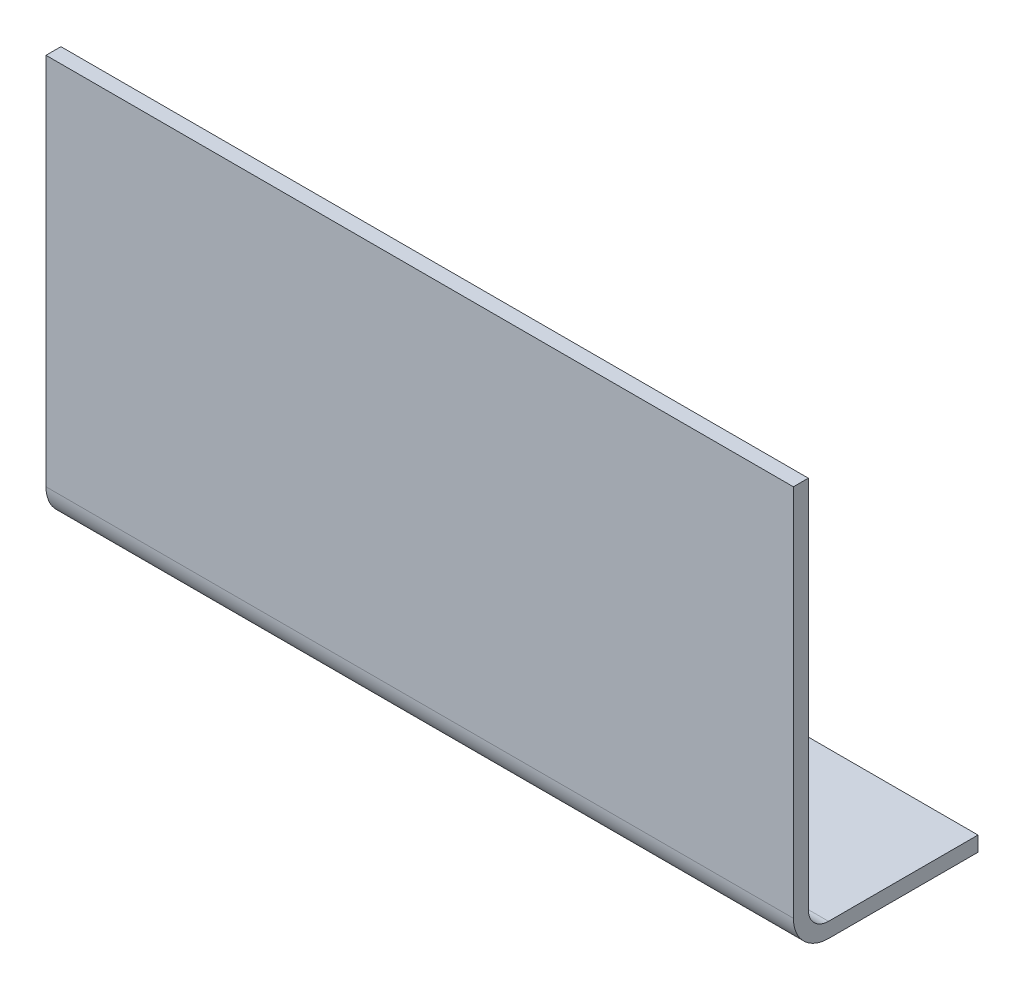
ISO-10303-21;
HEADER;
FILE_DESCRIPTION(('STEP AP214'),'2;1');
FILE_NAME('part.step','',(''),(''),'','','');
FILE_SCHEMA(('AUTOMOTIVE_DESIGN { 1 0 10303 214 1 1 1 1 }'));
ENDSEC;
DATA;
#1=APPLICATION_CONTEXT('core data for automotive mechanical design processes');
#2=APPLICATION_PROTOCOL_DEFINITION('international standard','automotive_design',2000,#1);
#3=PRODUCT_CONTEXT('',#1,'mechanical');
#4=PRODUCT('Part','Part','',(#3));
#5=PRODUCT_RELATED_PRODUCT_CATEGORY('part','',(#4));
#6=PRODUCT_DEFINITION_FORMATION('','',#4);
#7=PRODUCT_DEFINITION_CONTEXT('part definition',#1,'design');
#8=PRODUCT_DEFINITION('design','',#6,#7);
#9=PRODUCT_DEFINITION_SHAPE('','',#8);
#10=(LENGTH_UNIT() NAMED_UNIT(*) SI_UNIT(.MILLI.,.METRE.));
#11=(NAMED_UNIT(*) PLANE_ANGLE_UNIT() SI_UNIT($,.RADIAN.));
#12=(NAMED_UNIT(*) SI_UNIT($,.STERADIAN.) SOLID_ANGLE_UNIT());
#13=UNCERTAINTY_MEASURE_WITH_UNIT(LENGTH_MEASURE(1.E-05),#10,'distance_accuracy_value','');
#14=(GEOMETRIC_REPRESENTATION_CONTEXT(3) GLOBAL_UNCERTAINTY_ASSIGNED_CONTEXT((#13)) GLOBAL_UNIT_ASSIGNED_CONTEXT((#10,
#11,#12)) REPRESENTATION_CONTEXT('',''));
#15=CARTESIAN_POINT('',(0.,0.,0.));
#16=DIRECTION('',(0.,0.,1.));
#17=DIRECTION('',(1.,0.,0.));
#18=AXIS2_PLACEMENT_3D('',#15,#16,#17);
#19=CARTESIAN_POINT('',(50.,3.74646845151782,1.99999999999999));
#20=DIRECTION('',(0.,-1.,0.));
#21=DIRECTION('',(0.,0.,-1.));
#22=AXIS2_PLACEMENT_3D('',#19,#20,#21);
#23=PLANE('',#22);
#24=DIRECTION('',(0.,0.,1.));
#25=VECTOR('',#24,1.);
#26=CARTESIAN_POINT('',(-50.,3.74646845151782,1.99999999999999));
#27=LINE('',#26,#25);
#28=CARTESIAN_POINT('',(-50.,3.74646845151782,1.99999999999999));
#29=VERTEX_POINT('',#28);
#30=CARTESIAN_POINT('',(-50.,3.74646845151782,3.99999999999999));
#31=VERTEX_POINT('',#30);
#32=EDGE_CURVE('E129',#29,#31,#27,.T.);
#33=ORIENTED_EDGE('',*,*,#32,.T.);
#34=DIRECTION('',(-1.,0.,0.));
#35=VECTOR('',#34,1.);
#36=CARTESIAN_POINT('',(50.,3.74646845151782,3.99999999999999));
#37=LINE('',#36,#35);
#38=CARTESIAN_POINT('',(50.,3.74646845151782,3.99999999999999));
#39=VERTEX_POINT('',#38);
#40=EDGE_CURVE('E11',#39,#31,#37,.T.);
#41=ORIENTED_EDGE('',*,*,#40,.F.);
#42=DIRECTION('',(0.,0.,1.));
#43=VECTOR('',#42,1.);
#44=CARTESIAN_POINT('',(50.,3.74646845151782,1.99999999999999));
#45=LINE('',#44,#43);
#46=CARTESIAN_POINT('',(50.,3.74646845151782,1.99999999999999));
#47=VERTEX_POINT('',#46);
#48=EDGE_CURVE('E143',#47,#39,#45,.T.);
#49=ORIENTED_EDGE('',*,*,#48,.F.);
#50=DIRECTION('',(-1.,0.,0.));
#51=VECTOR('',#50,1.);
#52=CARTESIAN_POINT('',(50.,3.74646845151782,1.99999999999999));
#53=LINE('',#52,#51);
#54=EDGE_CURVE('E125',#47,#29,#53,.T.);
#55=ORIENTED_EDGE('',*,*,#54,.T.);
#56=EDGE_LOOP('',(#33,#41,#49,#55));
#57=FACE_BOUND('',#56,.T.);
#58=ADVANCED_FACE('F33',(#57),#23,.F.);
#59=CARTESIAN_POINT('',(50.,3.74646845151782,3.99999999999999));
#60=DIRECTION('',(0.,0.,-1.));
#61=DIRECTION('',(0.,1.,0.));
#62=AXIS2_PLACEMENT_3D('',#59,#60,#61);
#63=PLANE('',#62);
#64=DIRECTION('',(0.,-1.,0.));
#65=VECTOR('',#64,1.);
#66=CARTESIAN_POINT('',(-50.,3.74646845151782,3.99999999999999));
#67=LINE('',#66,#65);
#68=CARTESIAN_POINT('',(-50.,-46.2535315484822,3.99999999999999));
#69=VERTEX_POINT('',#68);
#70=EDGE_CURVE('E132',#31,#69,#67,.T.);
#71=ORIENTED_EDGE('',*,*,#70,.T.);
#72=DIRECTION('',(-1.,0.,0.));
#73=VECTOR('',#72,1.);
#74=CARTESIAN_POINT('',(50.,-46.2535315484822,3.99999999999999));
#75=LINE('',#74,#73);
#76=CARTESIAN_POINT('',(50.,-46.2535315484822,3.99999999999999));
#77=VERTEX_POINT('',#76);
#78=EDGE_CURVE('E41',#77,#69,#75,.T.);
#79=ORIENTED_EDGE('',*,*,#78,.F.);
#80=DIRECTION('',(0.,-1.,0.));
#81=VECTOR('',#80,1.);
#82=CARTESIAN_POINT('',(50.,3.74646845151782,3.99999999999999));
#83=LINE('',#82,#81);
#84=EDGE_CURVE('E92',#39,#77,#83,.T.);
#85=ORIENTED_EDGE('',*,*,#84,.F.);
#86=ORIENTED_EDGE('',*,*,#40,.T.);
#87=EDGE_LOOP('',(#71,#79,#85,#86));
#88=FACE_BOUND('',#87,.T.);
#89=ADVANCED_FACE('F178',(#88),#63,.F.);
#90=CARTESIAN_POINT('',(50.,-46.2535315484822,-0.700000000000011));
#91=DIRECTION('',(-1.,0.,0.));
#92=DIRECTION('',(0.,0.,1.));
#93=AXIS2_PLACEMENT_3D('',#90,#91,#92);
#94=CYLINDRICAL_SURFACE('',#93,4.7);
#95=CARTESIAN_POINT('',(-50.,-46.2535315484822,-0.700000000000011));
#96=DIRECTION('',(1.,0.,0.));
#97=DIRECTION('',(0.,0.,-1.));
#98=AXIS2_PLACEMENT_3D('',#95,#96,#97);
#99=CIRCLE('',#98,4.7);
#100=CARTESIAN_POINT('',(-50.,-50.9535315484822,-0.70000000000001));
#101=VERTEX_POINT('',#100);
#102=EDGE_CURVE('E134',#69,#101,#99,.T.);
#103=ORIENTED_EDGE('',*,*,#102,.T.);
#104=DIRECTION('',(-1.,0.,0.));
#105=VECTOR('',#104,1.);
#106=CARTESIAN_POINT('',(50.,-50.9535315484822,-0.70000000000001));
#107=LINE('',#106,#105);
#108=CARTESIAN_POINT('',(50.,-50.9535315484822,-0.70000000000001));
#109=VERTEX_POINT('',#108);
#110=EDGE_CURVE('E150',#109,#101,#107,.T.);
#111=ORIENTED_EDGE('',*,*,#110,.F.);
#112=CARTESIAN_POINT('',(50.,-46.2535315484822,-0.700000000000011));
#113=DIRECTION('',(1.,0.,0.));
#114=DIRECTION('',(0.,0.,-1.));
#115=AXIS2_PLACEMENT_3D('',#112,#113,#114);
#116=CIRCLE('',#115,4.7);
#117=EDGE_CURVE('E158',#77,#109,#116,.T.);
#118=ORIENTED_EDGE('',*,*,#117,.F.);
#119=ORIENTED_EDGE('',*,*,#78,.T.);
#120=EDGE_LOOP('',(#103,#111,#118,#119));
#121=FACE_BOUND('',#120,.T.);
#122=ADVANCED_FACE('F156',(#121),#94,.T.);
#123=CARTESIAN_POINT('',(50.,-50.9535315484822,-0.700000000000011));
#124=DIRECTION('',(0.,1.,0.));
#125=DIRECTION('',(0.,0.,1.));
#126=AXIS2_PLACEMENT_3D('',#123,#124,#125);
#127=PLANE('',#126);
#128=DIRECTION('',(0.,0.,-1.));
#129=VECTOR('',#128,1.);
#130=CARTESIAN_POINT('',(-50.,-50.9535315484822,-0.700000000000011));
#131=LINE('',#130,#129);
#132=CARTESIAN_POINT('',(-50.,-50.9535315484822,-20.7));
#133=VERTEX_POINT('',#132);
#134=EDGE_CURVE('E136',#101,#133,#131,.T.);
#135=ORIENTED_EDGE('',*,*,#134,.T.);
#136=DIRECTION('',(-1.,0.,0.));
#137=VECTOR('',#136,1.);
#138=CARTESIAN_POINT('',(50.,-50.9535315484822,-20.7));
#139=LINE('',#138,#137);
#140=CARTESIAN_POINT('',(50.,-50.9535315484822,-20.7));
#141=VERTEX_POINT('',#140);
#142=EDGE_CURVE('E147',#141,#133,#139,.T.);
#143=ORIENTED_EDGE('',*,*,#142,.F.);
#144=DIRECTION('',(0.,0.,-1.));
#145=VECTOR('',#144,1.);
#146=CARTESIAN_POINT('',(50.,-50.9535315484822,-0.700000000000011));
#147=LINE('',#146,#145);
#148=EDGE_CURVE('E170',#109,#141,#147,.T.);
#149=ORIENTED_EDGE('',*,*,#148,.F.);
#150=ORIENTED_EDGE('',*,*,#110,.T.);
#151=EDGE_LOOP('',(#135,#143,#149,#150));
#152=FACE_BOUND('',#151,.T.);
#153=ADVANCED_FACE('F166',(#152),#127,.F.);
#154=CARTESIAN_POINT('',(50.,-50.9535315484822,-20.7));
#155=DIRECTION('',(0.,0.,1.));
#156=DIRECTION('',(1.,0.,0.));
#157=AXIS2_PLACEMENT_3D('',#154,#155,#156);
#158=PLANE('',#157);
#159=DIRECTION('',(0.,1.,0.));
#160=VECTOR('',#159,1.);
#161=CARTESIAN_POINT('',(-50.,-50.9535315484822,-20.7));
#162=LINE('',#161,#160);
#163=CARTESIAN_POINT('',(-50.,-48.9535315484822,-20.7));
#164=VERTEX_POINT('',#163);
#165=EDGE_CURVE('E138',#133,#164,#162,.T.);
#166=ORIENTED_EDGE('',*,*,#165,.T.);
#167=DIRECTION('',(-1.,0.,0.));
#168=VECTOR('',#167,1.);
#169=CARTESIAN_POINT('',(50.,-48.9535315484822,-20.7));
#170=LINE('',#169,#168);
#171=CARTESIAN_POINT('',(50.,-48.9535315484822,-20.7));
#172=VERTEX_POINT('',#171);
#173=EDGE_CURVE('E120',#172,#164,#170,.T.);
#174=ORIENTED_EDGE('',*,*,#173,.F.);
#175=DIRECTION('',(0.,1.,0.));
#176=VECTOR('',#175,1.);
#177=CARTESIAN_POINT('',(50.,-50.9535315484822,-20.7));
#178=LINE('',#177,#176);
#179=EDGE_CURVE('E111',#141,#172,#178,.T.);
#180=ORIENTED_EDGE('',*,*,#179,.F.);
#181=ORIENTED_EDGE('',*,*,#142,.T.);
#182=EDGE_LOOP('',(#166,#174,#180,#181));
#183=FACE_BOUND('',#182,.T.);
#184=ADVANCED_FACE('F169',(#183),#158,.F.);
#185=CARTESIAN_POINT('',(50.,-48.9535315484822,-20.7));
#186=DIRECTION('',(0.,-1.,0.));
#187=DIRECTION('',(0.,0.,-1.));
#188=AXIS2_PLACEMENT_3D('',#185,#186,#187);
#189=PLANE('',#188);
#190=DIRECTION('',(0.,0.,1.));
#191=VECTOR('',#190,1.);
#192=CARTESIAN_POINT('',(-50.,-48.9535315484822,-20.7));
#193=LINE('',#192,#191);
#194=CARTESIAN_POINT('',(-50.,-48.9535315484822,-0.70000000000001));
#195=VERTEX_POINT('',#194);
#196=EDGE_CURVE('E119',#164,#195,#193,.T.);
#197=ORIENTED_EDGE('',*,*,#196,.T.);
#198=DIRECTION('',(-1.,0.,0.));
#199=VECTOR('',#198,1.);
#200=CARTESIAN_POINT('',(50.,-48.9535315484822,-0.70000000000001));
#201=LINE('',#200,#199);
#202=CARTESIAN_POINT('',(50.,-48.9535315484822,-0.70000000000001));
#203=VERTEX_POINT('',#202);
#204=EDGE_CURVE('E116',#203,#195,#201,.T.);
#205=ORIENTED_EDGE('',*,*,#204,.F.);
#206=DIRECTION('',(0.,0.,1.));
#207=VECTOR('',#206,1.);
#208=CARTESIAN_POINT('',(50.,-48.9535315484822,-20.7));
#209=LINE('',#208,#207);
#210=EDGE_CURVE('E105',#172,#203,#209,.T.);
#211=ORIENTED_EDGE('',*,*,#210,.F.);
#212=ORIENTED_EDGE('',*,*,#173,.T.);
#213=EDGE_LOOP('',(#197,#205,#211,#212));
#214=FACE_BOUND('',#213,.T.);
#215=ADVANCED_FACE('F117',(#214),#189,.F.);
#216=CARTESIAN_POINT('',(50.,-46.2535315484822,-0.70000000000001));
#217=DIRECTION('',(-1.,0.,0.));
#218=DIRECTION('',(0.,0.,1.));
#219=AXIS2_PLACEMENT_3D('',#216,#217,#218);
#220=CYLINDRICAL_SURFACE('',#219,2.7);
#221=CARTESIAN_POINT('',(-50.,-46.2535315484822,-0.70000000000001));
#222=DIRECTION('',(-1.,0.,0.));
#223=DIRECTION('',(0.,0.,1.));
#224=AXIS2_PLACEMENT_3D('',#221,#222,#223);
#225=CIRCLE('',#224,2.7);
#226=CARTESIAN_POINT('',(-50.,-46.2535315484822,1.99999999999999));
#227=VERTEX_POINT('',#226);
#228=EDGE_CURVE('E78',#195,#227,#225,.T.);
#229=ORIENTED_EDGE('',*,*,#228,.T.);
#230=DIRECTION('',(-1.,0.,0.));
#231=VECTOR('',#230,1.);
#232=CARTESIAN_POINT('',(50.,-46.2535315484822,1.99999999999999));
#233=LINE('',#232,#231);
#234=CARTESIAN_POINT('',(50.,-46.2535315484822,1.99999999999999));
#235=VERTEX_POINT('',#234);
#236=EDGE_CURVE('E121',#235,#227,#233,.T.);
#237=ORIENTED_EDGE('',*,*,#236,.F.);
#238=CARTESIAN_POINT('',(50.,-46.2535315484822,-0.70000000000001));
#239=DIRECTION('',(-1.,0.,0.));
#240=DIRECTION('',(0.,0.,1.));
#241=AXIS2_PLACEMENT_3D('',#238,#239,#240);
#242=CIRCLE('',#241,2.7);
#243=EDGE_CURVE('E109',#203,#235,#242,.T.);
#244=ORIENTED_EDGE('',*,*,#243,.F.);
#245=ORIENTED_EDGE('',*,*,#204,.T.);
#246=EDGE_LOOP('',(#229,#237,#244,#245));
#247=FACE_BOUND('',#246,.T.);
#248=ADVANCED_FACE('F123',(#247),#220,.F.);
#249=CARTESIAN_POINT('',(50.,-46.2535315484822,1.99999999999999));
#250=DIRECTION('',(0.,0.,1.));
#251=DIRECTION('',(0.,-1.,0.));
#252=AXIS2_PLACEMENT_3D('',#249,#250,#251);
#253=PLANE('',#252);
#254=DIRECTION('',(0.,1.,0.));
#255=VECTOR('',#254,1.);
#256=CARTESIAN_POINT('',(-50.,-46.2535315484822,1.99999999999999));
#257=LINE('',#256,#255);
#258=EDGE_CURVE('E84',#227,#29,#257,.T.);
#259=ORIENTED_EDGE('',*,*,#258,.T.);
#260=ORIENTED_EDGE('',*,*,#54,.F.);
#261=DIRECTION('',(0.,1.,0.));
#262=VECTOR('',#261,1.);
#263=CARTESIAN_POINT('',(50.,-46.2535315484822,1.99999999999999));
#264=LINE('',#263,#262);
#265=EDGE_CURVE('E49',#235,#47,#264,.T.);
#266=ORIENTED_EDGE('',*,*,#265,.F.);
#267=ORIENTED_EDGE('',*,*,#236,.T.);
#268=EDGE_LOOP('',(#259,#260,#266,#267));
#269=FACE_BOUND('',#268,.T.);
#270=ADVANCED_FACE('F194',(#269),#253,.F.);
#271=CARTESIAN_POINT('',(50.,-46.2535315484822,-0.700000000000011));
#272=DIRECTION('',(1.,0.,0.));
#273=DIRECTION('',(0.,0.,-1.));
#274=AXIS2_PLACEMENT_3D('',#271,#272,#273);
#275=PLANE('',#274);
#276=ORIENTED_EDGE('',*,*,#48,.T.);
#277=ORIENTED_EDGE('',*,*,#84,.T.);
#278=ORIENTED_EDGE('',*,*,#117,.T.);
#279=ORIENTED_EDGE('',*,*,#148,.T.);
#280=ORIENTED_EDGE('',*,*,#179,.T.);
#281=ORIENTED_EDGE('',*,*,#210,.T.);
#282=ORIENTED_EDGE('',*,*,#243,.T.);
#283=ORIENTED_EDGE('',*,*,#265,.T.);
#284=EDGE_LOOP('',(#276,#277,#278,#279,#280,#281,#282,#283));
#285=FACE_BOUND('',#284,.T.);
#286=ADVANCED_FACE('F107',(#285),#275,.T.);
#287=CARTESIAN_POINT('',(-50.,-46.2535315484822,-0.700000000000011));
#288=DIRECTION('',(1.,0.,0.));
#289=DIRECTION('',(0.,0.,-1.));
#290=AXIS2_PLACEMENT_3D('',#287,#288,#289);
#291=PLANE('',#290);
#292=ORIENTED_EDGE('',*,*,#32,.F.);
#293=ORIENTED_EDGE('',*,*,#258,.F.);
#294=ORIENTED_EDGE('',*,*,#228,.F.);
#295=ORIENTED_EDGE('',*,*,#196,.F.);
#296=ORIENTED_EDGE('',*,*,#165,.F.);
#297=ORIENTED_EDGE('',*,*,#134,.F.);
#298=ORIENTED_EDGE('',*,*,#102,.F.);
#299=ORIENTED_EDGE('',*,*,#70,.F.);
#300=EDGE_LOOP('',(#292,#293,#294,#295,#296,#297,#298,#299));
#301=FACE_BOUND('',#300,.T.);
#302=ADVANCED_FACE('F162',(#301),#291,.F.);
#303=CLOSED_SHELL('',(#58,#89,#122,#153,#184,#215,#248,#270,#286,#302));
#304=MANIFOLD_SOLID_BREP('B2',#303);
#305=ADVANCED_BREP_SHAPE_REPRESENTATION('',(#18,#304),#14);
#306=SHAPE_DEFINITION_REPRESENTATION(#9,#305);
ENDSEC;
END-ISO-10303-21;
